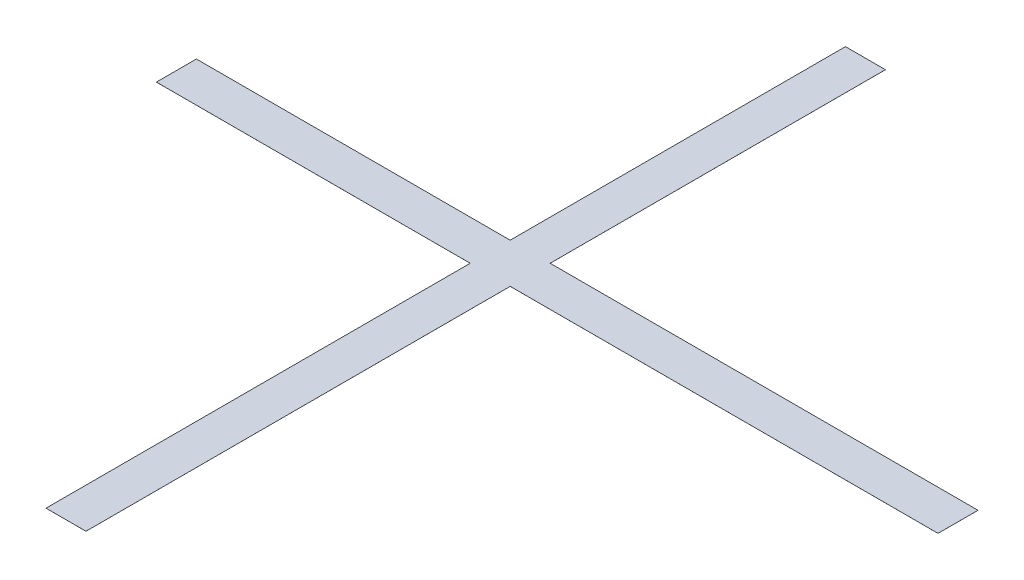
ISO-10303-21;
HEADER;
FILE_DESCRIPTION(('STEP AP214'),'2;1');
FILE_NAME('part.step','',(''),(''),'','','');
FILE_SCHEMA(('AUTOMOTIVE_DESIGN { 1 0 10303 214 1 1 1 1 }'));
ENDSEC;
DATA;
#1=APPLICATION_CONTEXT('core data for automotive mechanical design processes');
#2=APPLICATION_PROTOCOL_DEFINITION('international standard','automotive_design',2000,#1);
#3=PRODUCT_CONTEXT('',#1,'mechanical');
#4=PRODUCT('Part','Part','',(#3));
#5=PRODUCT_RELATED_PRODUCT_CATEGORY('part','',(#4));
#6=PRODUCT_DEFINITION_FORMATION('','',#4);
#7=PRODUCT_DEFINITION_CONTEXT('part definition',#1,'design');
#8=PRODUCT_DEFINITION('design','',#6,#7);
#9=PRODUCT_DEFINITION_SHAPE('','',#8);
#10=(LENGTH_UNIT() NAMED_UNIT(*) SI_UNIT(.MILLI.,.METRE.));
#11=(NAMED_UNIT(*) PLANE_ANGLE_UNIT() SI_UNIT($,.RADIAN.));
#12=(NAMED_UNIT(*) SI_UNIT($,.STERADIAN.) SOLID_ANGLE_UNIT());
#13=UNCERTAINTY_MEASURE_WITH_UNIT(LENGTH_MEASURE(1.E-05),#10,'distance_accuracy_value','');
#14=(GEOMETRIC_REPRESENTATION_CONTEXT(3) GLOBAL_UNCERTAINTY_ASSIGNED_CONTEXT((#13)) GLOBAL_UNIT_ASSIGNED_CONTEXT((#10,
#11,#12)) REPRESENTATION_CONTEXT('',''));
#15=CARTESIAN_POINT('',(0.,0.,0.));
#16=DIRECTION('',(0.,0.,1.));
#17=DIRECTION('',(1.,0.,0.));
#18=AXIS2_PLACEMENT_3D('',#15,#16,#17);
#19=CARTESIAN_POINT('',(424.05022340663,0.01,-922.489020101041));
#20=DIRECTION('',(1.,0.,0.));
#21=DIRECTION('',(0.,0.,-1.));
#22=AXIS2_PLACEMENT_3D('',#19,#20,#21);
#23=PLANE('',#22);
#24=DIRECTION('',(0.,0.,1.));
#25=VECTOR('',#24,1.);
#26=CARTESIAN_POINT('',(424.05022340663,0.,-922.489020101041));
#27=LINE('',#26,#25);
#28=CARTESIAN_POINT('',(424.05022340663,0.,-922.489020101041));
#29=VERTEX_POINT('',#28);
#30=CARTESIAN_POINT('',(424.05022340663,0.,-754.742667039066));
#31=VERTEX_POINT('',#30);
#32=EDGE_CURVE('E165',#29,#31,#27,.T.);
#33=ORIENTED_EDGE('',*,*,#32,.F.);
#34=DIRECTION('',(0.,-1.,0.));
#35=VECTOR('',#34,1.);
#36=CARTESIAN_POINT('',(424.05022340663,0.01,-922.489020101041));
#37=LINE('',#36,#35);
#38=CARTESIAN_POINT('',(424.05022340663,0.01,-922.489020101041));
#39=VERTEX_POINT('',#38);
#40=EDGE_CURVE('E11',#39,#29,#37,.T.);
#41=ORIENTED_EDGE('',*,*,#40,.F.);
#42=DIRECTION('',(0.,0.,1.));
#43=VECTOR('',#42,1.);
#44=CARTESIAN_POINT('',(424.05022340663,0.01,-922.489020101041));
#45=LINE('',#44,#43);
#46=CARTESIAN_POINT('',(424.05022340663,0.01,-754.742667039066));
#47=VERTEX_POINT('',#46);
#48=EDGE_CURVE('E206',#39,#47,#45,.T.);
#49=ORIENTED_EDGE('',*,*,#48,.T.);
#50=DIRECTION('',(0.,-1.,0.));
#51=VECTOR('',#50,1.);
#52=CARTESIAN_POINT('',(424.05022340663,0.01,-754.742667039066));
#53=LINE('',#52,#51);
#54=EDGE_CURVE('E42',#47,#31,#53,.T.);
#55=ORIENTED_EDGE('',*,*,#54,.T.);
#56=EDGE_LOOP('',(#33,#41,#49,#55));
#57=FACE_BOUND('',#56,.T.);
#58=ADVANCED_FACE('F39',(#57),#23,.T.);
#59=CARTESIAN_POINT('',(404.050223406631,0.01,-922.489020101041));
#60=DIRECTION('',(0.,0.,-1.));
#61=DIRECTION('',(-1.,0.,0.));
#62=AXIS2_PLACEMENT_3D('',#59,#60,#61);
#63=PLANE('',#62);
#64=DIRECTION('',(1.,0.,0.));
#65=VECTOR('',#64,1.);
#66=CARTESIAN_POINT('',(404.050223406631,0.,-922.489020101041));
#67=LINE('',#66,#65);
#68=CARTESIAN_POINT('',(404.050223406631,0.,-922.489020101041));
#69=VERTEX_POINT('',#68);
#70=EDGE_CURVE('E203',#69,#29,#67,.T.);
#71=ORIENTED_EDGE('',*,*,#70,.F.);
#72=DIRECTION('',(0.,-1.,0.));
#73=VECTOR('',#72,1.);
#74=CARTESIAN_POINT('',(404.050223406631,0.01,-922.489020101041));
#75=LINE('',#74,#73);
#76=CARTESIAN_POINT('',(404.050223406631,0.01,-922.489020101041));
#77=VERTEX_POINT('',#76);
#78=EDGE_CURVE('E49',#77,#69,#75,.T.);
#79=ORIENTED_EDGE('',*,*,#78,.F.);
#80=DIRECTION('',(1.,0.,0.));
#81=VECTOR('',#80,1.);
#82=CARTESIAN_POINT('',(404.050223406631,0.01,-922.489020101041));
#83=LINE('',#82,#81);
#84=EDGE_CURVE('E141',#77,#39,#83,.T.);
#85=ORIENTED_EDGE('',*,*,#84,.T.);
#86=ORIENTED_EDGE('',*,*,#40,.T.);
#87=EDGE_LOOP('',(#71,#79,#85,#86));
#88=FACE_BOUND('',#87,.T.);
#89=ADVANCED_FACE('F239',(#88),#63,.T.);
#90=CARTESIAN_POINT('',(404.050223406631,0.01,-922.489020101041));
#91=DIRECTION('',(1.,0.,0.));
#92=DIRECTION('',(0.,0.,-1.));
#93=AXIS2_PLACEMENT_3D('',#90,#91,#92);
#94=PLANE('',#93);
#95=DIRECTION('',(0.,0.,1.));
#96=VECTOR('',#95,1.);
#97=CARTESIAN_POINT('',(404.050223406631,0.,-922.489020101041));
#98=LINE('',#97,#96);
#99=CARTESIAN_POINT('',(404.050223406631,0.,-754.742667039066));
#100=VERTEX_POINT('',#99);
#101=EDGE_CURVE('E146',#69,#100,#98,.T.);
#102=ORIENTED_EDGE('',*,*,#101,.T.);
#103=DIRECTION('',(0.,-1.,0.));
#104=VECTOR('',#103,1.);
#105=CARTESIAN_POINT('',(404.050223406631,0.01,-754.742667039066));
#106=LINE('',#105,#104);
#107=CARTESIAN_POINT('',(404.050223406631,0.01,-754.742667039066));
#108=VERTEX_POINT('',#107);
#109=EDGE_CURVE('E144',#108,#100,#106,.T.);
#110=ORIENTED_EDGE('',*,*,#109,.F.);
#111=DIRECTION('',(0.,0.,1.));
#112=VECTOR('',#111,1.);
#113=CARTESIAN_POINT('',(404.050223406631,0.01,-922.489020101041));
#114=LINE('',#113,#112);
#115=EDGE_CURVE('E136',#77,#108,#114,.T.);
#116=ORIENTED_EDGE('',*,*,#115,.F.);
#117=ORIENTED_EDGE('',*,*,#78,.T.);
#118=EDGE_LOOP('',(#102,#110,#116,#117));
#119=FACE_BOUND('',#118,.T.);
#120=ADVANCED_FACE('F145',(#119),#94,.F.);
#121=CARTESIAN_POINT('',(247.039930484308,0.01,-754.742667039066));
#122=DIRECTION('',(0.,0.,-1.));
#123=DIRECTION('',(-1.,0.,0.));
#124=AXIS2_PLACEMENT_3D('',#121,#122,#123);
#125=PLANE('',#124);
#126=DIRECTION('',(1.,0.,0.));
#127=VECTOR('',#126,1.);
#128=CARTESIAN_POINT('',(247.039930484308,0.,-754.742667039066));
#129=LINE('',#128,#127);
#130=CARTESIAN_POINT('',(247.039930484308,0.,-754.742667039066));
#131=VERTEX_POINT('',#130);
#132=EDGE_CURVE('E198',#131,#100,#129,.T.);
#133=ORIENTED_EDGE('',*,*,#132,.F.);
#134=DIRECTION('',(0.,-1.,0.));
#135=VECTOR('',#134,1.);
#136=CARTESIAN_POINT('',(247.039930484308,0.01,-754.742667039066));
#137=LINE('',#136,#135);
#138=CARTESIAN_POINT('',(247.039930484308,0.01,-754.742667039066));
#139=VERTEX_POINT('',#138);
#140=EDGE_CURVE('E151',#139,#131,#137,.T.);
#141=ORIENTED_EDGE('',*,*,#140,.F.);
#142=DIRECTION('',(1.,0.,0.));
#143=VECTOR('',#142,1.);
#144=CARTESIAN_POINT('',(247.039930484308,0.01,-754.742667039066));
#145=LINE('',#144,#143);
#146=EDGE_CURVE('E140',#139,#108,#145,.T.);
#147=ORIENTED_EDGE('',*,*,#146,.T.);
#148=ORIENTED_EDGE('',*,*,#109,.T.);
#149=EDGE_LOOP('',(#133,#141,#147,#148));
#150=FACE_BOUND('',#149,.T.);
#151=ADVANCED_FACE('F153',(#150),#125,.T.);
#152=CARTESIAN_POINT('',(247.039930484308,0.01,-754.742667039066));
#153=DIRECTION('',(1.,0.,0.));
#154=DIRECTION('',(0.,0.,-1.));
#155=AXIS2_PLACEMENT_3D('',#152,#153,#154);
#156=PLANE('',#155);
#157=DIRECTION('',(0.,0.,1.));
#158=VECTOR('',#157,1.);
#159=CARTESIAN_POINT('',(247.039930484308,0.,-754.742667039066));
#160=LINE('',#159,#158);
#161=CARTESIAN_POINT('',(247.039930484308,0.,-734.742667039042));
#162=VERTEX_POINT('',#161);
#163=EDGE_CURVE('E195',#131,#162,#160,.T.);
#164=ORIENTED_EDGE('',*,*,#163,.T.);
#165=DIRECTION('',(0.,-1.,0.));
#166=VECTOR('',#165,1.);
#167=CARTESIAN_POINT('',(247.039930484308,0.01,-734.742667039042));
#168=LINE('',#167,#166);
#169=CARTESIAN_POINT('',(247.039930484308,0.01,-734.742667039042));
#170=VERTEX_POINT('',#169);
#171=EDGE_CURVE('E212',#170,#162,#168,.T.);
#172=ORIENTED_EDGE('',*,*,#171,.F.);
#173=DIRECTION('',(0.,0.,1.));
#174=VECTOR('',#173,1.);
#175=CARTESIAN_POINT('',(247.039930484308,0.01,-754.742667039066));
#176=LINE('',#175,#174);
#177=EDGE_CURVE('E156',#139,#170,#176,.T.);
#178=ORIENTED_EDGE('',*,*,#177,.F.);
#179=ORIENTED_EDGE('',*,*,#140,.T.);
#180=EDGE_LOOP('',(#164,#172,#178,#179));
#181=FACE_BOUND('',#180,.T.);
#182=ADVANCED_FACE('F252',(#181),#156,.F.);
#183=CARTESIAN_POINT('',(247.039930484308,0.01,-734.742667039042));
#184=DIRECTION('',(0.,0.,-1.));
#185=DIRECTION('',(-1.,0.,0.));
#186=AXIS2_PLACEMENT_3D('',#183,#184,#185);
#187=PLANE('',#186);
#188=DIRECTION('',(1.,0.,0.));
#189=VECTOR('',#188,1.);
#190=CARTESIAN_POINT('',(247.039930484308,0.,-734.742667039042));
#191=LINE('',#190,#189);
#192=CARTESIAN_POINT('',(404.050223406631,0.,-734.742667039042));
#193=VERTEX_POINT('',#192);
#194=EDGE_CURVE('E191',#162,#193,#191,.T.);
#195=ORIENTED_EDGE('',*,*,#194,.T.);
#196=DIRECTION('',(0.,-1.,0.));
#197=VECTOR('',#196,1.);
#198=CARTESIAN_POINT('',(404.050223406631,0.01,-734.742667039042));
#199=LINE('',#198,#197);
#200=CARTESIAN_POINT('',(404.050223406631,0.01,-734.742667039042));
#201=VERTEX_POINT('',#200);
#202=EDGE_CURVE('E216',#201,#193,#199,.T.);
#203=ORIENTED_EDGE('',*,*,#202,.F.);
#204=DIRECTION('',(1.,0.,0.));
#205=VECTOR('',#204,1.);
#206=CARTESIAN_POINT('',(247.039930484308,0.01,-734.742667039042));
#207=LINE('',#206,#205);
#208=EDGE_CURVE('E159',#170,#201,#207,.T.);
#209=ORIENTED_EDGE('',*,*,#208,.F.);
#210=ORIENTED_EDGE('',*,*,#171,.T.);
#211=EDGE_LOOP('',(#195,#203,#209,#210));
#212=FACE_BOUND('',#211,.T.);
#213=ADVANCED_FACE('F255',(#212),#187,.F.);
#214=CARTESIAN_POINT('',(404.050223406631,0.01,-522.489020101041));
#215=DIRECTION('',(-1.,0.,0.));
#216=DIRECTION('',(0.,0.,1.));
#217=AXIS2_PLACEMENT_3D('',#214,#215,#216);
#218=PLANE('',#217);
#219=DIRECTION('',(0.,0.,-1.));
#220=VECTOR('',#219,1.);
#221=CARTESIAN_POINT('',(404.050223406631,0.,-522.489020101041));
#222=LINE('',#221,#220);
#223=CARTESIAN_POINT('',(404.050223406631,0.,-522.489020101041));
#224=VERTEX_POINT('',#223);
#225=EDGE_CURVE('E187',#224,#193,#222,.T.);
#226=ORIENTED_EDGE('',*,*,#225,.F.);
#227=DIRECTION('',(0.,-1.,0.));
#228=VECTOR('',#227,1.);
#229=CARTESIAN_POINT('',(404.050223406631,0.01,-522.489020101041));
#230=LINE('',#229,#228);
#231=CARTESIAN_POINT('',(404.050223406631,0.01,-522.489020101041));
#232=VERTEX_POINT('',#231);
#233=EDGE_CURVE('E219',#232,#224,#230,.T.);
#234=ORIENTED_EDGE('',*,*,#233,.F.);
#235=DIRECTION('',(0.,0.,-1.));
#236=VECTOR('',#235,1.);
#237=CARTESIAN_POINT('',(404.050223406631,0.01,-522.489020101041));
#238=LINE('',#237,#236);
#239=EDGE_CURVE('E383',#232,#201,#238,.T.);
#240=ORIENTED_EDGE('',*,*,#239,.T.);
#241=ORIENTED_EDGE('',*,*,#202,.T.);
#242=EDGE_LOOP('',(#226,#234,#240,#241));
#243=FACE_BOUND('',#242,.T.);
#244=ADVANCED_FACE('F259',(#243),#218,.T.);
#245=CARTESIAN_POINT('',(404.050223406631,0.01,-522.489020101041));
#246=DIRECTION('',(0.,0.,-1.));
#247=DIRECTION('',(-1.,0.,0.));
#248=AXIS2_PLACEMENT_3D('',#245,#246,#247);
#249=PLANE('',#248);
#250=DIRECTION('',(1.,0.,0.));
#251=VECTOR('',#250,1.);
#252=CARTESIAN_POINT('',(404.050223406631,0.,-522.489020101041));
#253=LINE('',#252,#251);
#254=CARTESIAN_POINT('',(424.05022340663,0.,-522.489020101041));
#255=VERTEX_POINT('',#254);
#256=EDGE_CURVE('E184',#224,#255,#253,.T.);
#257=ORIENTED_EDGE('',*,*,#256,.T.);
#258=DIRECTION('',(0.,-1.,0.));
#259=VECTOR('',#258,1.);
#260=CARTESIAN_POINT('',(424.05022340663,0.01,-522.489020101041));
#261=LINE('',#260,#259);
#262=CARTESIAN_POINT('',(424.05022340663,0.01,-522.489020101041));
#263=VERTEX_POINT('',#262);
#264=EDGE_CURVE('E222',#263,#255,#261,.T.);
#265=ORIENTED_EDGE('',*,*,#264,.F.);
#266=DIRECTION('',(1.,0.,0.));
#267=VECTOR('',#266,1.);
#268=CARTESIAN_POINT('',(404.050223406631,0.01,-522.489020101041));
#269=LINE('',#268,#267);
#270=EDGE_CURVE('E377',#232,#263,#269,.T.);
#271=ORIENTED_EDGE('',*,*,#270,.F.);
#272=ORIENTED_EDGE('',*,*,#233,.T.);
#273=EDGE_LOOP('',(#257,#265,#271,#272));
#274=FACE_BOUND('',#273,.T.);
#275=ADVANCED_FACE('F263',(#274),#249,.F.);
#276=CARTESIAN_POINT('',(424.05022340663,0.01,-522.489020101041));
#277=DIRECTION('',(-1.,0.,0.));
#278=DIRECTION('',(0.,0.,1.));
#279=AXIS2_PLACEMENT_3D('',#276,#277,#278);
#280=PLANE('',#279);
#281=DIRECTION('',(0.,0.,-1.));
#282=VECTOR('',#281,1.);
#283=CARTESIAN_POINT('',(424.05022340663,0.,-522.489020101041));
#284=LINE('',#283,#282);
#285=CARTESIAN_POINT('',(424.05022340663,0.,-734.742667039042));
#286=VERTEX_POINT('',#285);
#287=EDGE_CURVE('E181',#255,#286,#284,.T.);
#288=ORIENTED_EDGE('',*,*,#287,.T.);
#289=DIRECTION('',(0.,-1.,0.));
#290=VECTOR('',#289,1.);
#291=CARTESIAN_POINT('',(424.05022340663,0.01,-734.742667039042));
#292=LINE('',#291,#290);
#293=CARTESIAN_POINT('',(424.05022340663,0.01,-734.742667039042));
#294=VERTEX_POINT('',#293);
#295=EDGE_CURVE('E226',#294,#286,#292,.T.);
#296=ORIENTED_EDGE('',*,*,#295,.F.);
#297=DIRECTION('',(0.,0.,-1.));
#298=VECTOR('',#297,1.);
#299=CARTESIAN_POINT('',(424.05022340663,0.01,-522.489020101041));
#300=LINE('',#299,#298);
#301=EDGE_CURVE('E374',#263,#294,#300,.T.);
#302=ORIENTED_EDGE('',*,*,#301,.F.);
#303=ORIENTED_EDGE('',*,*,#264,.T.);
#304=EDGE_LOOP('',(#288,#296,#302,#303));
#305=FACE_BOUND('',#304,.T.);
#306=ADVANCED_FACE('F267',(#305),#280,.F.);
#307=CARTESIAN_POINT('',(424.05022340663,0.01,-734.742667039042));
#308=DIRECTION('',(0.,0.,-1.));
#309=DIRECTION('',(-1.,0.,0.));
#310=AXIS2_PLACEMENT_3D('',#307,#308,#309);
#311=PLANE('',#310);
#312=DIRECTION('',(1.,0.,0.));
#313=VECTOR('',#312,1.);
#314=CARTESIAN_POINT('',(424.05022340663,0.,-734.742667039042));
#315=LINE('',#314,#313);
#316=CARTESIAN_POINT('',(638.115813283578,0.,-734.742667039042));
#317=VERTEX_POINT('',#316);
#318=EDGE_CURVE('E177',#286,#317,#315,.T.);
#319=ORIENTED_EDGE('',*,*,#318,.T.);
#320=DIRECTION('',(0.,-1.,0.));
#321=VECTOR('',#320,1.);
#322=CARTESIAN_POINT('',(638.115813283578,0.01,-734.742667039042));
#323=LINE('',#322,#321);
#324=CARTESIAN_POINT('',(638.115813283578,0.01,-734.742667039042));
#325=VERTEX_POINT('',#324);
#326=EDGE_CURVE('E230',#325,#317,#323,.T.);
#327=ORIENTED_EDGE('',*,*,#326,.F.);
#328=DIRECTION('',(1.,0.,0.));
#329=VECTOR('',#328,1.);
#330=CARTESIAN_POINT('',(424.05022340663,0.01,-734.742667039042));
#331=LINE('',#330,#329);
#332=EDGE_CURVE('E372',#294,#325,#331,.T.);
#333=ORIENTED_EDGE('',*,*,#332,.F.);
#334=ORIENTED_EDGE('',*,*,#295,.T.);
#335=EDGE_LOOP('',(#319,#327,#333,#334));
#336=FACE_BOUND('',#335,.T.);
#337=ADVANCED_FACE('F271',(#336),#311,.F.);
#338=CARTESIAN_POINT('',(638.115813283578,0.01,-754.742667039066));
#339=DIRECTION('',(1.,0.,0.));
#340=DIRECTION('',(0.,0.,-1.));
#341=AXIS2_PLACEMENT_3D('',#338,#339,#340);
#342=PLANE('',#341);
#343=DIRECTION('',(0.,0.,1.));
#344=VECTOR('',#343,1.);
#345=CARTESIAN_POINT('',(638.115813283578,0.,-754.742667039066));
#346=LINE('',#345,#344);
#347=CARTESIAN_POINT('',(638.115813283578,0.,-754.742667039066));
#348=VERTEX_POINT('',#347);
#349=EDGE_CURVE('E173',#348,#317,#346,.T.);
#350=ORIENTED_EDGE('',*,*,#349,.F.);
#351=DIRECTION('',(0.,-1.,0.));
#352=VECTOR('',#351,1.);
#353=CARTESIAN_POINT('',(638.115813283578,0.01,-754.742667039066));
#354=LINE('',#353,#352);
#355=CARTESIAN_POINT('',(638.115813283578,0.01,-754.742667039066));
#356=VERTEX_POINT('',#355);
#357=EDGE_CURVE('E232',#356,#348,#354,.T.);
#358=ORIENTED_EDGE('',*,*,#357,.F.);
#359=DIRECTION('',(0.,0.,1.));
#360=VECTOR('',#359,1.);
#361=CARTESIAN_POINT('',(638.115813283578,0.01,-754.742667039066));
#362=LINE('',#361,#360);
#363=EDGE_CURVE('E397',#356,#325,#362,.T.);
#364=ORIENTED_EDGE('',*,*,#363,.T.);
#365=ORIENTED_EDGE('',*,*,#326,.T.);
#366=EDGE_LOOP('',(#350,#358,#364,#365));
#367=FACE_BOUND('',#366,.T.);
#368=ADVANCED_FACE('F275',(#367),#342,.T.);
#369=CARTESIAN_POINT('',(424.05022340663,0.01,-754.742667039066));
#370=DIRECTION('',(0.,0.,-1.));
#371=DIRECTION('',(-1.,0.,0.));
#372=AXIS2_PLACEMENT_3D('',#369,#370,#371);
#373=PLANE('',#372);
#374=DIRECTION('',(1.,0.,0.));
#375=VECTOR('',#374,1.);
#376=CARTESIAN_POINT('',(424.05022340663,0.,-754.742667039066));
#377=LINE('',#376,#375);
#378=EDGE_CURVE('E169',#31,#348,#377,.T.);
#379=ORIENTED_EDGE('',*,*,#378,.F.);
#380=ORIENTED_EDGE('',*,*,#54,.F.);
#381=DIRECTION('',(1.,0.,0.));
#382=VECTOR('',#381,1.);
#383=CARTESIAN_POINT('',(424.05022340663,0.01,-754.742667039066));
#384=LINE('',#383,#382);
#385=EDGE_CURVE('E400',#47,#356,#384,.T.);
#386=ORIENTED_EDGE('',*,*,#385,.T.);
#387=ORIENTED_EDGE('',*,*,#357,.T.);
#388=EDGE_LOOP('',(#379,#380,#386,#387));
#389=FACE_BOUND('',#388,.T.);
#390=ADVANCED_FACE('F236',(#389),#373,.T.);
#391=CARTESIAN_POINT('',(0.,0.01,0.));
#392=DIRECTION('',(0.,1.,0.));
#393=DIRECTION('',(0.,0.,1.));
#394=AXIS2_PLACEMENT_3D('',#391,#392,#393);
#395=PLANE('',#394);
#396=ORIENTED_EDGE('',*,*,#48,.F.);
#397=ORIENTED_EDGE('',*,*,#84,.F.);
#398=ORIENTED_EDGE('',*,*,#115,.T.);
#399=ORIENTED_EDGE('',*,*,#146,.F.);
#400=ORIENTED_EDGE('',*,*,#177,.T.);
#401=ORIENTED_EDGE('',*,*,#208,.T.);
#402=ORIENTED_EDGE('',*,*,#239,.F.);
#403=ORIENTED_EDGE('',*,*,#270,.T.);
#404=ORIENTED_EDGE('',*,*,#301,.T.);
#405=ORIENTED_EDGE('',*,*,#332,.T.);
#406=ORIENTED_EDGE('',*,*,#363,.F.);
#407=ORIENTED_EDGE('',*,*,#385,.F.);
#408=EDGE_LOOP('',(#396,#397,#398,#399,#400,#401,#402,#403,#404,#405,#406,#407));
#409=FACE_BOUND('',#408,.T.);
#410=ADVANCED_FACE('F138',(#409),#395,.T.);
#411=CARTESIAN_POINT('',(0.,0.,0.));
#412=DIRECTION('',(0.,1.,0.));
#413=DIRECTION('',(0.,0.,1.));
#414=AXIS2_PLACEMENT_3D('',#411,#412,#413);
#415=PLANE('',#414);
#416=ORIENTED_EDGE('',*,*,#32,.T.);
#417=ORIENTED_EDGE('',*,*,#378,.T.);
#418=ORIENTED_EDGE('',*,*,#349,.T.);
#419=ORIENTED_EDGE('',*,*,#318,.F.);
#420=ORIENTED_EDGE('',*,*,#287,.F.);
#421=ORIENTED_EDGE('',*,*,#256,.F.);
#422=ORIENTED_EDGE('',*,*,#225,.T.);
#423=ORIENTED_EDGE('',*,*,#194,.F.);
#424=ORIENTED_EDGE('',*,*,#163,.F.);
#425=ORIENTED_EDGE('',*,*,#132,.T.);
#426=ORIENTED_EDGE('',*,*,#101,.F.);
#427=ORIENTED_EDGE('',*,*,#70,.T.);
#428=EDGE_LOOP('',(#416,#417,#418,#419,#420,#421,#422,#423,#424,#425,#426,#427));
#429=FACE_BOUND('',#428,.T.);
#430=ADVANCED_FACE('F238',(#429),#415,.F.);
#431=CLOSED_SHELL('',(#58,#89,#120,#151,#182,#213,#244,#275,#306,#337,#368,#390,#410,#430));
#432=MANIFOLD_SOLID_BREP('B2',#431);
#433=ADVANCED_BREP_SHAPE_REPRESENTATION('',(#18,#432),#14);
#434=SHAPE_DEFINITION_REPRESENTATION(#9,#433);
ENDSEC;
END-ISO-10303-21;
